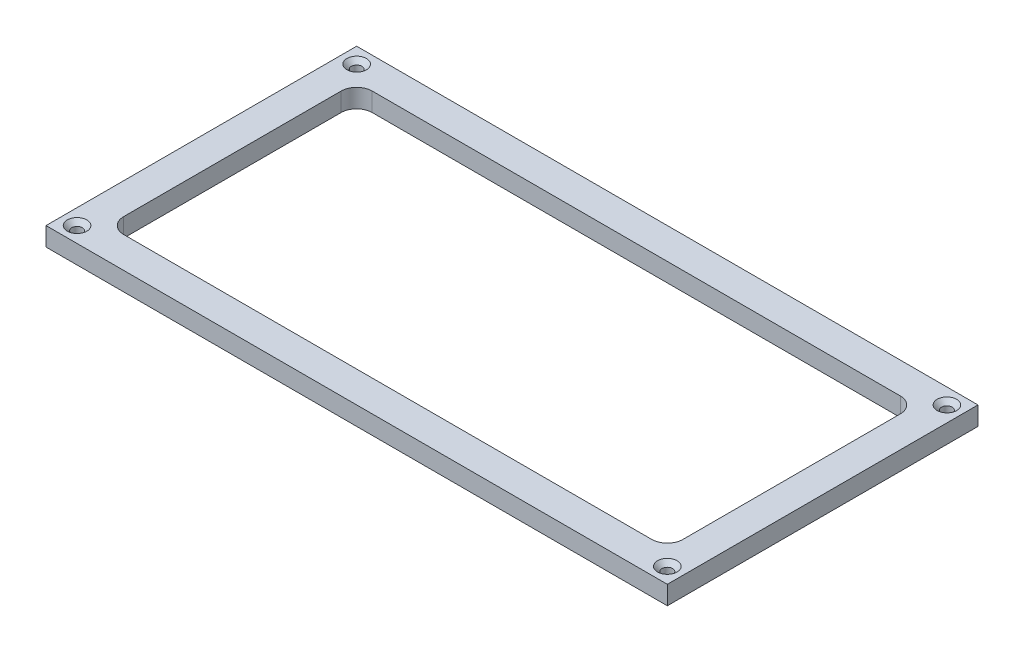
ISO-10303-21;
HEADER;
FILE_DESCRIPTION(('STEP AP214'),'2;1');
FILE_NAME('part.step','',(''),(''),'','','');
FILE_SCHEMA(('AUTOMOTIVE_DESIGN { 1 0 10303 214 1 1 1 1 }'));
ENDSEC;
DATA;
#1=APPLICATION_CONTEXT('core data for automotive mechanical design processes');
#2=APPLICATION_PROTOCOL_DEFINITION('international standard','automotive_design',2000,#1);
#3=PRODUCT_CONTEXT('',#1,'mechanical');
#4=PRODUCT('Part','Part','',(#3));
#5=PRODUCT_RELATED_PRODUCT_CATEGORY('part','',(#4));
#6=PRODUCT_DEFINITION_FORMATION('','',#4);
#7=PRODUCT_DEFINITION_CONTEXT('part definition',#1,'design');
#8=PRODUCT_DEFINITION('design','',#6,#7);
#9=PRODUCT_DEFINITION_SHAPE('','',#8);
#10=(LENGTH_UNIT() NAMED_UNIT(*) SI_UNIT(.MILLI.,.METRE.));
#11=(NAMED_UNIT(*) PLANE_ANGLE_UNIT() SI_UNIT($,.RADIAN.));
#12=(NAMED_UNIT(*) SI_UNIT($,.STERADIAN.) SOLID_ANGLE_UNIT());
#13=UNCERTAINTY_MEASURE_WITH_UNIT(LENGTH_MEASURE(1.E-05),#10,'distance_accuracy_value','');
#14=(GEOMETRIC_REPRESENTATION_CONTEXT(3) GLOBAL_UNCERTAINTY_ASSIGNED_CONTEXT((#13)) GLOBAL_UNIT_ASSIGNED_CONTEXT((#10,
#11,#12)) REPRESENTATION_CONTEXT('',''));
#15=CARTESIAN_POINT('',(0.,0.,0.));
#16=DIRECTION('',(0.,0.,1.));
#17=DIRECTION('',(1.,0.,0.));
#18=AXIS2_PLACEMENT_3D('',#15,#16,#17);
#19=CARTESIAN_POINT('',(0.,6.,0.));
#20=DIRECTION('',(0.,-1.,0.));
#21=DIRECTION('',(0.,0.,-1.));
#22=AXIS2_PLACEMENT_3D('',#19,#20,#21);
#23=PLANE('',#22);
#24=CARTESIAN_POINT('',(5.,6.,-95.));
#25=DIRECTION('',(0.,1.,0.));
#26=DIRECTION('',(0.,0.,1.));
#27=AXIS2_PLACEMENT_3D('',#24,#25,#26);
#28=CIRCLE('',#27,3.15);
#29=CARTESIAN_POINT('',(5.,6.,-91.85));
#30=VERTEX_POINT('',#29);
#31=EDGE_CURVE('E308',#30,#30,#28,.T.);
#32=ORIENTED_EDGE('',*,*,#31,.F.);
#33=EDGE_LOOP('',(#32));
#34=FACE_BOUND('',#33,.T.);
#35=CARTESIAN_POINT('',(195.,6.,-95.));
#36=DIRECTION('',(0.,1.,0.));
#37=DIRECTION('',(0.,0.,1.));
#38=AXIS2_PLACEMENT_3D('',#35,#36,#37);
#39=CIRCLE('',#38,3.14999999999999);
#40=CARTESIAN_POINT('',(195.,6.,-91.85));
#41=VERTEX_POINT('',#40);
#42=EDGE_CURVE('E301',#41,#41,#39,.T.);
#43=ORIENTED_EDGE('',*,*,#42,.F.);
#44=EDGE_LOOP('',(#43));
#45=FACE_BOUND('',#44,.T.);
#46=CARTESIAN_POINT('',(195.,6.,-5.));
#47=DIRECTION('',(0.,1.,0.));
#48=DIRECTION('',(0.,0.,1.));
#49=AXIS2_PLACEMENT_3D('',#46,#47,#48);
#50=CIRCLE('',#49,3.14999999999999);
#51=CARTESIAN_POINT('',(195.,6.,-1.85000000000001));
#52=VERTEX_POINT('',#51);
#53=EDGE_CURVE('E294',#52,#52,#50,.T.);
#54=ORIENTED_EDGE('',*,*,#53,.F.);
#55=EDGE_LOOP('',(#54));
#56=FACE_BOUND('',#55,.T.);
#57=DIRECTION('',(0.,0.,1.));
#58=VECTOR('',#57,1.);
#59=CARTESIAN_POINT('',(0.,6.,0.));
#60=LINE('',#59,#58);
#61=CARTESIAN_POINT('',(0.,6.,-100.));
#62=VERTEX_POINT('',#61);
#63=CARTESIAN_POINT('',(0.,6.,0.));
#64=VERTEX_POINT('',#63);
#65=EDGE_CURVE('E134',#62,#64,#60,.T.);
#66=ORIENTED_EDGE('',*,*,#65,.T.);
#67=DIRECTION('',(1.,0.,0.));
#68=VECTOR('',#67,1.);
#69=CARTESIAN_POINT('',(0.,6.,0.));
#70=LINE('',#69,#68);
#71=CARTESIAN_POINT('',(200.,6.,0.));
#72=VERTEX_POINT('',#71);
#73=EDGE_CURVE('E123',#64,#72,#70,.T.);
#74=ORIENTED_EDGE('',*,*,#73,.T.);
#75=DIRECTION('',(0.,0.,-1.));
#76=VECTOR('',#75,1.);
#77=CARTESIAN_POINT('',(200.,6.,0.));
#78=LINE('',#77,#76);
#79=CARTESIAN_POINT('',(200.,6.,-100.));
#80=VERTEX_POINT('',#79);
#81=EDGE_CURVE('E133',#72,#80,#78,.T.);
#82=ORIENTED_EDGE('',*,*,#81,.T.);
#83=DIRECTION('',(-1.,0.,0.));
#84=VECTOR('',#83,1.);
#85=CARTESIAN_POINT('',(0.,6.,-100.));
#86=LINE('',#85,#84);
#87=EDGE_CURVE('E139',#80,#62,#86,.T.);
#88=ORIENTED_EDGE('',*,*,#87,.T.);
#89=EDGE_LOOP('',(#66,#74,#82,#88));
#90=FACE_BOUND('',#89,.T.);
#91=DIRECTION('',(1.,0.,0.));
#92=VECTOR('',#91,1.);
#93=CARTESIAN_POINT('',(10.,6.,-10.));
#94=LINE('',#93,#92);
#95=CARTESIAN_POINT('',(15.,6.,-10.));
#96=VERTEX_POINT('',#95);
#97=CARTESIAN_POINT('',(185.,6.,-10.));
#98=VERTEX_POINT('',#97);
#99=EDGE_CURVE('E218',#96,#98,#94,.T.);
#100=ORIENTED_EDGE('',*,*,#99,.F.);
#101=CARTESIAN_POINT('',(15.,6.,-15.));
#102=DIRECTION('',(0.,-1.,0.));
#103=DIRECTION('',(0.,0.,-1.));
#104=AXIS2_PLACEMENT_3D('',#101,#102,#103);
#105=CIRCLE('',#104,5.);
#106=CARTESIAN_POINT('',(10.,6.,-15.));
#107=VERTEX_POINT('',#106);
#108=EDGE_CURVE('E172',#96,#107,#105,.T.);
#109=ORIENTED_EDGE('',*,*,#108,.T.);
#110=DIRECTION('',(0.,0.,1.));
#111=VECTOR('',#110,1.);
#112=CARTESIAN_POINT('',(10.,6.,-90.));
#113=LINE('',#112,#111);
#114=CARTESIAN_POINT('',(10.,6.,-85.));
#115=VERTEX_POINT('',#114);
#116=EDGE_CURVE('E188',#115,#107,#113,.T.);
#117=ORIENTED_EDGE('',*,*,#116,.F.);
#118=CARTESIAN_POINT('',(15.,6.,-85.));
#119=DIRECTION('',(0.,-1.,0.));
#120=DIRECTION('',(0.,0.,-1.));
#121=AXIS2_PLACEMENT_3D('',#118,#119,#120);
#122=CIRCLE('',#121,5.);
#123=CARTESIAN_POINT('',(15.,6.,-90.));
#124=VERTEX_POINT('',#123);
#125=EDGE_CURVE('E41',#115,#124,#122,.T.);
#126=ORIENTED_EDGE('',*,*,#125,.T.);
#127=DIRECTION('',(-1.,0.,0.));
#128=VECTOR('',#127,1.);
#129=CARTESIAN_POINT('',(10.,6.,-90.));
#130=LINE('',#129,#128);
#131=CARTESIAN_POINT('',(185.,6.,-90.));
#132=VERTEX_POINT('',#131);
#133=EDGE_CURVE('E186',#132,#124,#130,.T.);
#134=ORIENTED_EDGE('',*,*,#133,.F.);
#135=CARTESIAN_POINT('',(185.,6.,-85.));
#136=DIRECTION('',(0.,-1.,0.));
#137=DIRECTION('',(0.,0.,-1.));
#138=AXIS2_PLACEMENT_3D('',#135,#136,#137);
#139=CIRCLE('',#138,5.);
#140=CARTESIAN_POINT('',(190.,6.,-85.));
#141=VERTEX_POINT('',#140);
#142=EDGE_CURVE('E180',#132,#141,#139,.T.);
#143=ORIENTED_EDGE('',*,*,#142,.T.);
#144=DIRECTION('',(0.,0.,-1.));
#145=VECTOR('',#144,1.);
#146=CARTESIAN_POINT('',(190.,6.,-90.));
#147=LINE('',#146,#145);
#148=CARTESIAN_POINT('',(190.,6.,-15.));
#149=VERTEX_POINT('',#148);
#150=EDGE_CURVE('E194',#149,#141,#147,.T.);
#151=ORIENTED_EDGE('',*,*,#150,.F.);
#152=CARTESIAN_POINT('',(185.,6.,-15.));
#153=DIRECTION('',(0.,-1.,0.));
#154=DIRECTION('',(0.,0.,-1.));
#155=AXIS2_PLACEMENT_3D('',#152,#153,#154);
#156=CIRCLE('',#155,5.);
#157=EDGE_CURVE('E176',#149,#98,#156,.T.);
#158=ORIENTED_EDGE('',*,*,#157,.T.);
#159=EDGE_LOOP('',(#100,#109,#117,#126,#134,#143,#151,#158));
#160=FACE_BOUND('',#159,.T.);
#161=CARTESIAN_POINT('',(5.,6.,-5.));
#162=DIRECTION('',(0.,1.,0.));
#163=DIRECTION('',(0.,0.,1.));
#164=AXIS2_PLACEMENT_3D('',#161,#162,#163);
#165=CIRCLE('',#164,3.15);
#166=CARTESIAN_POINT('',(5.,6.,-1.85));
#167=VERTEX_POINT('',#166);
#168=EDGE_CURVE('E284',#167,#167,#165,.T.);
#169=ORIENTED_EDGE('',*,*,#168,.F.);
#170=EDGE_LOOP('',(#169));
#171=FACE_BOUND('',#170,.T.);
#172=ADVANCED_FACE('F33',(#34,#45,#56,#90,#160,#171),#23,.F.);
#173=CARTESIAN_POINT('',(0.,6.,0.));
#174=DIRECTION('',(1.,0.,0.));
#175=DIRECTION('',(0.,0.,-1.));
#176=AXIS2_PLACEMENT_3D('',#173,#174,#175);
#177=PLANE('',#176);
#178=DIRECTION('',(0.,0.,1.));
#179=VECTOR('',#178,1.);
#180=CARTESIAN_POINT('',(0.,0.,0.));
#181=LINE('',#180,#179);
#182=CARTESIAN_POINT('',(0.,0.,-100.));
#183=VERTEX_POINT('',#182);
#184=CARTESIAN_POINT('',(0.,0.,0.));
#185=VERTEX_POINT('',#184);
#186=EDGE_CURVE('E147',#183,#185,#181,.T.);
#187=ORIENTED_EDGE('',*,*,#186,.T.);
#188=DIRECTION('',(0.,-1.,0.));
#189=VECTOR('',#188,1.);
#190=CARTESIAN_POINT('',(0.,6.,0.));
#191=LINE('',#190,#189);
#192=EDGE_CURVE('E127',#64,#185,#191,.T.);
#193=ORIENTED_EDGE('',*,*,#192,.F.);
#194=ORIENTED_EDGE('',*,*,#65,.F.);
#195=DIRECTION('',(0.,-1.,0.));
#196=VECTOR('',#195,1.);
#197=CARTESIAN_POINT('',(0.,6.,-100.));
#198=LINE('',#197,#196);
#199=EDGE_CURVE('E225',#62,#183,#198,.T.);
#200=ORIENTED_EDGE('',*,*,#199,.T.);
#201=EDGE_LOOP('',(#187,#193,#194,#200));
#202=FACE_BOUND('',#201,.T.);
#203=ADVANCED_FACE('F145',(#202),#177,.F.);
#204=CARTESIAN_POINT('',(0.,6.,0.));
#205=DIRECTION('',(0.,0.,-1.));
#206=DIRECTION('',(-1.,0.,0.));
#207=AXIS2_PLACEMENT_3D('',#204,#205,#206);
#208=PLANE('',#207);
#209=DIRECTION('',(1.,0.,0.));
#210=VECTOR('',#209,1.);
#211=CARTESIAN_POINT('',(0.,0.,0.));
#212=LINE('',#211,#210);
#213=CARTESIAN_POINT('',(200.,0.,0.));
#214=VERTEX_POINT('',#213);
#215=EDGE_CURVE('E227',#185,#214,#212,.T.);
#216=ORIENTED_EDGE('',*,*,#215,.T.);
#217=DIRECTION('',(0.,-1.,0.));
#218=VECTOR('',#217,1.);
#219=CARTESIAN_POINT('',(200.,6.,0.));
#220=LINE('',#219,#218);
#221=EDGE_CURVE('E130',#72,#214,#220,.T.);
#222=ORIENTED_EDGE('',*,*,#221,.F.);
#223=ORIENTED_EDGE('',*,*,#73,.F.);
#224=ORIENTED_EDGE('',*,*,#192,.T.);
#225=EDGE_LOOP('',(#216,#222,#223,#224));
#226=FACE_BOUND('',#225,.T.);
#227=ADVANCED_FACE('F125',(#226),#208,.F.);
#228=CARTESIAN_POINT('',(200.,6.,0.));
#229=DIRECTION('',(-1.,0.,0.));
#230=DIRECTION('',(0.,0.,1.));
#231=AXIS2_PLACEMENT_3D('',#228,#229,#230);
#232=PLANE('',#231);
#233=DIRECTION('',(0.,0.,-1.));
#234=VECTOR('',#233,1.);
#235=CARTESIAN_POINT('',(200.,0.,0.));
#236=LINE('',#235,#234);
#237=CARTESIAN_POINT('',(200.,0.,-100.));
#238=VERTEX_POINT('',#237);
#239=EDGE_CURVE('E229',#214,#238,#236,.T.);
#240=ORIENTED_EDGE('',*,*,#239,.T.);
#241=DIRECTION('',(0.,-1.,0.));
#242=VECTOR('',#241,1.);
#243=CARTESIAN_POINT('',(200.,6.,-100.));
#244=LINE('',#243,#242);
#245=EDGE_CURVE('E152',#80,#238,#244,.T.);
#246=ORIENTED_EDGE('',*,*,#245,.F.);
#247=ORIENTED_EDGE('',*,*,#81,.F.);
#248=ORIENTED_EDGE('',*,*,#221,.T.);
#249=EDGE_LOOP('',(#240,#246,#247,#248));
#250=FACE_BOUND('',#249,.T.);
#251=ADVANCED_FACE('F239',(#250),#232,.F.);
#252=CARTESIAN_POINT('',(0.,6.,-100.));
#253=DIRECTION('',(0.,0.,1.));
#254=DIRECTION('',(1.,0.,0.));
#255=AXIS2_PLACEMENT_3D('',#252,#253,#254);
#256=PLANE('',#255);
#257=DIRECTION('',(-1.,0.,0.));
#258=VECTOR('',#257,1.);
#259=CARTESIAN_POINT('',(0.,0.,-100.));
#260=LINE('',#259,#258);
#261=EDGE_CURVE('E143',#238,#183,#260,.T.);
#262=ORIENTED_EDGE('',*,*,#261,.T.);
#263=ORIENTED_EDGE('',*,*,#199,.F.);
#264=ORIENTED_EDGE('',*,*,#87,.F.);
#265=ORIENTED_EDGE('',*,*,#245,.T.);
#266=EDGE_LOOP('',(#262,#263,#264,#265));
#267=FACE_BOUND('',#266,.T.);
#268=ADVANCED_FACE('F236',(#267),#256,.F.);
#269=CARTESIAN_POINT('',(0.,0.,0.));
#270=DIRECTION('',(0.,-1.,0.));
#271=DIRECTION('',(0.,0.,-1.));
#272=AXIS2_PLACEMENT_3D('',#269,#270,#271);
#273=PLANE('',#272);
#274=CARTESIAN_POINT('',(5.,0.,-95.));
#275=DIRECTION('',(0.,1.,0.));
#276=DIRECTION('',(0.,0.,1.));
#277=AXIS2_PLACEMENT_3D('',#274,#275,#276);
#278=CIRCLE('',#277,1.7);
#279=CARTESIAN_POINT('',(5.,0.,-93.3));
#280=VERTEX_POINT('',#279);
#281=EDGE_CURVE('E270',#280,#280,#278,.T.);
#282=ORIENTED_EDGE('',*,*,#281,.T.);
#283=EDGE_LOOP('',(#282));
#284=FACE_BOUND('',#283,.T.);
#285=CARTESIAN_POINT('',(195.,0.,-95.));
#286=DIRECTION('',(0.,1.,0.));
#287=DIRECTION('',(0.,0.,1.));
#288=AXIS2_PLACEMENT_3D('',#285,#286,#287);
#289=CIRCLE('',#288,1.70000000000001);
#290=CARTESIAN_POINT('',(195.,0.,-93.3));
#291=VERTEX_POINT('',#290);
#292=EDGE_CURVE('E274',#291,#291,#289,.T.);
#293=ORIENTED_EDGE('',*,*,#292,.T.);
#294=EDGE_LOOP('',(#293));
#295=FACE_BOUND('',#294,.T.);
#296=CARTESIAN_POINT('',(195.,0.,-5.));
#297=DIRECTION('',(0.,1.,0.));
#298=DIRECTION('',(0.,0.,1.));
#299=AXIS2_PLACEMENT_3D('',#296,#297,#298);
#300=CIRCLE('',#299,1.70000000000001);
#301=CARTESIAN_POINT('',(195.,0.,-3.29999999999999));
#302=VERTEX_POINT('',#301);
#303=EDGE_CURVE('E278',#302,#302,#300,.T.);
#304=ORIENTED_EDGE('',*,*,#303,.T.);
#305=EDGE_LOOP('',(#304));
#306=FACE_BOUND('',#305,.T.);
#307=CARTESIAN_POINT('',(5.,0.,-5.));
#308=DIRECTION('',(0.,1.,0.));
#309=DIRECTION('',(0.,0.,1.));
#310=AXIS2_PLACEMENT_3D('',#307,#308,#309);
#311=CIRCLE('',#310,1.7);
#312=CARTESIAN_POINT('',(5.,0.,-3.30000000000001));
#313=VERTEX_POINT('',#312);
#314=EDGE_CURVE('E212',#313,#313,#311,.T.);
#315=ORIENTED_EDGE('',*,*,#314,.T.);
#316=EDGE_LOOP('',(#315));
#317=FACE_BOUND('',#316,.T.);
#318=DIRECTION('',(-1.,0.,0.));
#319=VECTOR('',#318,1.);
#320=CARTESIAN_POINT('',(10.,0.,-90.));
#321=LINE('',#320,#319);
#322=CARTESIAN_POINT('',(185.,0.,-90.));
#323=VERTEX_POINT('',#322);
#324=CARTESIAN_POINT('',(15.,0.,-90.));
#325=VERTEX_POINT('',#324);
#326=EDGE_CURVE('E202',#323,#325,#321,.T.);
#327=ORIENTED_EDGE('',*,*,#326,.T.);
#328=CARTESIAN_POINT('',(15.,0.,-85.));
#329=DIRECTION('',(0.,-1.,0.));
#330=DIRECTION('',(0.,0.,-1.));
#331=AXIS2_PLACEMENT_3D('',#328,#329,#330);
#332=CIRCLE('',#331,5.);
#333=CARTESIAN_POINT('',(10.,0.,-85.));
#334=VERTEX_POINT('',#333);
#335=EDGE_CURVE('E11',#325,#334,#332,.F.);
#336=ORIENTED_EDGE('',*,*,#335,.T.);
#337=DIRECTION('',(0.,0.,1.));
#338=VECTOR('',#337,1.);
#339=CARTESIAN_POINT('',(10.,0.,-90.));
#340=LINE('',#339,#338);
#341=CARTESIAN_POINT('',(10.,0.,-15.));
#342=VERTEX_POINT('',#341);
#343=EDGE_CURVE('E193',#334,#342,#340,.T.);
#344=ORIENTED_EDGE('',*,*,#343,.T.);
#345=CARTESIAN_POINT('',(15.,0.,-15.));
#346=DIRECTION('',(0.,-1.,0.));
#347=DIRECTION('',(0.,0.,-1.));
#348=AXIS2_PLACEMENT_3D('',#345,#346,#347);
#349=CIRCLE('',#348,5.);
#350=CARTESIAN_POINT('',(15.,0.,-10.));
#351=VERTEX_POINT('',#350);
#352=EDGE_CURVE('E174',#342,#351,#349,.F.);
#353=ORIENTED_EDGE('',*,*,#352,.T.);
#354=DIRECTION('',(1.,0.,0.));
#355=VECTOR('',#354,1.);
#356=CARTESIAN_POINT('',(10.,0.,-10.));
#357=LINE('',#356,#355);
#358=CARTESIAN_POINT('',(185.,0.,-10.));
#359=VERTEX_POINT('',#358);
#360=EDGE_CURVE('E206',#351,#359,#357,.T.);
#361=ORIENTED_EDGE('',*,*,#360,.T.);
#362=CARTESIAN_POINT('',(185.,0.,-15.));
#363=DIRECTION('',(0.,-1.,0.));
#364=DIRECTION('',(0.,0.,-1.));
#365=AXIS2_PLACEMENT_3D('',#362,#363,#364);
#366=CIRCLE('',#365,5.);
#367=CARTESIAN_POINT('',(190.,0.,-15.));
#368=VERTEX_POINT('',#367);
#369=EDGE_CURVE('E178',#359,#368,#366,.F.);
#370=ORIENTED_EDGE('',*,*,#369,.T.);
#371=DIRECTION('',(0.,0.,-1.));
#372=VECTOR('',#371,1.);
#373=CARTESIAN_POINT('',(190.,0.,-90.));
#374=LINE('',#373,#372);
#375=CARTESIAN_POINT('',(190.,0.,-85.));
#376=VERTEX_POINT('',#375);
#377=EDGE_CURVE('E209',#368,#376,#374,.T.);
#378=ORIENTED_EDGE('',*,*,#377,.T.);
#379=CARTESIAN_POINT('',(185.,0.,-85.));
#380=DIRECTION('',(0.,-1.,0.));
#381=DIRECTION('',(0.,0.,-1.));
#382=AXIS2_PLACEMENT_3D('',#379,#380,#381);
#383=CIRCLE('',#382,5.);
#384=EDGE_CURVE('E55',#376,#323,#383,.F.);
#385=ORIENTED_EDGE('',*,*,#384,.T.);
#386=EDGE_LOOP('',(#327,#336,#344,#353,#361,#370,#378,#385));
#387=FACE_BOUND('',#386,.T.);
#388=ORIENTED_EDGE('',*,*,#186,.F.);
#389=ORIENTED_EDGE('',*,*,#261,.F.);
#390=ORIENTED_EDGE('',*,*,#239,.F.);
#391=ORIENTED_EDGE('',*,*,#215,.F.);
#392=EDGE_LOOP('',(#388,#389,#390,#391));
#393=FACE_BOUND('',#392,.T.);
#394=ADVANCED_FACE('F199',(#284,#295,#306,#317,#387,#393),#273,.T.);
#395=CARTESIAN_POINT('',(10.,0.,-90.));
#396=DIRECTION('',(-1.,0.,0.));
#397=DIRECTION('',(0.,0.,1.));
#398=AXIS2_PLACEMENT_3D('',#395,#396,#397);
#399=PLANE('',#398);
#400=ORIENTED_EDGE('',*,*,#116,.T.);
#401=DIRECTION('',(0.,1.,0.));
#402=VECTOR('',#401,1.);
#403=CARTESIAN_POINT('',(10.,0.,-15.));
#404=LINE('',#403,#402);
#405=EDGE_CURVE('E161',#107,#342,#404,.F.);
#406=ORIENTED_EDGE('',*,*,#405,.T.);
#407=ORIENTED_EDGE('',*,*,#343,.F.);
#408=DIRECTION('',(0.,1.,0.));
#409=VECTOR('',#408,1.);
#410=CARTESIAN_POINT('',(10.,6.,-85.));
#411=LINE('',#410,#409);
#412=EDGE_CURVE('E158',#334,#115,#411,.T.);
#413=ORIENTED_EDGE('',*,*,#412,.T.);
#414=EDGE_LOOP('',(#400,#406,#407,#413));
#415=FACE_BOUND('',#414,.T.);
#416=ADVANCED_FACE('F204',(#415),#399,.F.);
#417=CARTESIAN_POINT('',(10.,0.,-90.));
#418=DIRECTION('',(0.,0.,-1.));
#419=DIRECTION('',(-1.,0.,0.));
#420=AXIS2_PLACEMENT_3D('',#417,#418,#419);
#421=PLANE('',#420);
#422=ORIENTED_EDGE('',*,*,#326,.F.);
#423=DIRECTION('',(0.,1.,0.));
#424=VECTOR('',#423,1.);
#425=CARTESIAN_POINT('',(185.,6.,-90.));
#426=LINE('',#425,#424);
#427=EDGE_CURVE('E169',#323,#132,#426,.T.);
#428=ORIENTED_EDGE('',*,*,#427,.T.);
#429=ORIENTED_EDGE('',*,*,#133,.T.);
#430=DIRECTION('',(0.,1.,0.));
#431=VECTOR('',#430,1.);
#432=CARTESIAN_POINT('',(15.,0.,-90.));
#433=LINE('',#432,#431);
#434=EDGE_CURVE('E48',#124,#325,#433,.F.);
#435=ORIENTED_EDGE('',*,*,#434,.T.);
#436=EDGE_LOOP('',(#422,#428,#429,#435));
#437=FACE_BOUND('',#436,.T.);
#438=ADVANCED_FACE('F191',(#437),#421,.F.);
#439=CARTESIAN_POINT('',(190.,0.,-90.));
#440=DIRECTION('',(1.,0.,0.));
#441=DIRECTION('',(0.,0.,-1.));
#442=AXIS2_PLACEMENT_3D('',#439,#440,#441);
#443=PLANE('',#442);
#444=ORIENTED_EDGE('',*,*,#377,.F.);
#445=DIRECTION('',(0.,1.,0.));
#446=VECTOR('',#445,1.);
#447=CARTESIAN_POINT('',(190.,6.,-15.));
#448=LINE('',#447,#446);
#449=EDGE_CURVE('E165',#368,#149,#448,.T.);
#450=ORIENTED_EDGE('',*,*,#449,.T.);
#451=ORIENTED_EDGE('',*,*,#150,.T.);
#452=DIRECTION('',(0.,1.,0.));
#453=VECTOR('',#452,1.);
#454=CARTESIAN_POINT('',(190.,0.,-85.));
#455=LINE('',#454,#453);
#456=EDGE_CURVE('E163',#141,#376,#455,.F.);
#457=ORIENTED_EDGE('',*,*,#456,.T.);
#458=EDGE_LOOP('',(#444,#450,#451,#457));
#459=FACE_BOUND('',#458,.T.);
#460=ADVANCED_FACE('F348',(#459),#443,.F.);
#461=CARTESIAN_POINT('',(10.,0.,-10.));
#462=DIRECTION('',(0.,0.,1.));
#463=DIRECTION('',(1.,0.,0.));
#464=AXIS2_PLACEMENT_3D('',#461,#462,#463);
#465=PLANE('',#464);
#466=ORIENTED_EDGE('',*,*,#360,.F.);
#467=DIRECTION('',(0.,1.,0.));
#468=VECTOR('',#467,1.);
#469=CARTESIAN_POINT('',(15.,6.,-10.));
#470=LINE('',#469,#468);
#471=EDGE_CURVE('E150',#351,#96,#470,.T.);
#472=ORIENTED_EDGE('',*,*,#471,.T.);
#473=ORIENTED_EDGE('',*,*,#99,.T.);
#474=DIRECTION('',(0.,1.,0.));
#475=VECTOR('',#474,1.);
#476=CARTESIAN_POINT('',(185.,0.,-10.));
#477=LINE('',#476,#475);
#478=EDGE_CURVE('E148',#98,#359,#477,.F.);
#479=ORIENTED_EDGE('',*,*,#478,.T.);
#480=EDGE_LOOP('',(#466,#472,#473,#479));
#481=FACE_BOUND('',#480,.T.);
#482=ADVANCED_FACE('F350',(#481),#465,.F.);
#483=CARTESIAN_POINT('',(15.,0.,-15.));
#484=DIRECTION('',(0.,-1.,0.));
#485=DIRECTION('',(0.,0.,-1.));
#486=AXIS2_PLACEMENT_3D('',#483,#484,#485);
#487=CYLINDRICAL_SURFACE('',#486,5.);
#488=ORIENTED_EDGE('',*,*,#352,.F.);
#489=ORIENTED_EDGE('',*,*,#405,.F.);
#490=ORIENTED_EDGE('',*,*,#108,.F.);
#491=ORIENTED_EDGE('',*,*,#471,.F.);
#492=EDGE_LOOP('',(#488,#489,#490,#491));
#493=FACE_BOUND('',#492,.T.);
#494=ADVANCED_FACE('F353',(#493),#487,.F.);
#495=CARTESIAN_POINT('',(185.,0.,-15.));
#496=DIRECTION('',(0.,-1.,0.));
#497=DIRECTION('',(0.,0.,-1.));
#498=AXIS2_PLACEMENT_3D('',#495,#496,#497);
#499=CYLINDRICAL_SURFACE('',#498,5.);
#500=ORIENTED_EDGE('',*,*,#369,.F.);
#501=ORIENTED_EDGE('',*,*,#478,.F.);
#502=ORIENTED_EDGE('',*,*,#157,.F.);
#503=ORIENTED_EDGE('',*,*,#449,.F.);
#504=EDGE_LOOP('',(#500,#501,#502,#503));
#505=FACE_BOUND('',#504,.T.);
#506=ADVANCED_FACE('F358',(#505),#499,.F.);
#507=CARTESIAN_POINT('',(185.,0.,-85.));
#508=DIRECTION('',(0.,-1.,0.));
#509=DIRECTION('',(0.,0.,-1.));
#510=AXIS2_PLACEMENT_3D('',#507,#508,#509);
#511=CYLINDRICAL_SURFACE('',#510,5.);
#512=ORIENTED_EDGE('',*,*,#384,.F.);
#513=ORIENTED_EDGE('',*,*,#456,.F.);
#514=ORIENTED_EDGE('',*,*,#142,.F.);
#515=ORIENTED_EDGE('',*,*,#427,.F.);
#516=EDGE_LOOP('',(#512,#513,#514,#515));
#517=FACE_BOUND('',#516,.T.);
#518=ADVANCED_FACE('F371',(#517),#511,.F.);
#519=CARTESIAN_POINT('',(15.,0.,-85.));
#520=DIRECTION('',(0.,-1.,0.));
#521=DIRECTION('',(0.,0.,-1.));
#522=AXIS2_PLACEMENT_3D('',#519,#520,#521);
#523=CYLINDRICAL_SURFACE('',#522,5.);
#524=ORIENTED_EDGE('',*,*,#335,.F.);
#525=ORIENTED_EDGE('',*,*,#434,.F.);
#526=ORIENTED_EDGE('',*,*,#125,.F.);
#527=ORIENTED_EDGE('',*,*,#412,.F.);
#528=EDGE_LOOP('',(#524,#525,#526,#527));
#529=FACE_BOUND('',#528,.T.);
#530=ADVANCED_FACE('F35',(#529),#523,.F.);
#531=CARTESIAN_POINT('',(5.,6.,-5.));
#532=DIRECTION('',(0.,1.,0.));
#533=DIRECTION('',(0.,0.,1.));
#534=AXIS2_PLACEMENT_3D('',#531,#532,#533);
#535=CYLINDRICAL_SURFACE('',#534,1.7);
#536=ORIENTED_EDGE('',*,*,#314,.F.);
#537=EDGE_LOOP('',(#536));
#538=FACE_BOUND('',#537,.T.);
#539=CARTESIAN_POINT('',(5.,4.55,-5.));
#540=DIRECTION('',(0.,1.,0.));
#541=DIRECTION('',(0.,0.,1.));
#542=AXIS2_PLACEMENT_3D('',#539,#540,#541);
#543=CIRCLE('',#542,1.7);
#544=CARTESIAN_POINT('',(5.,4.55,-3.30000000000001));
#545=VERTEX_POINT('',#544);
#546=EDGE_CURVE('E282',#545,#545,#543,.T.);
#547=ORIENTED_EDGE('',*,*,#546,.T.);
#548=EDGE_LOOP('',(#547));
#549=FACE_BOUND('',#548,.T.);
#550=ADVANCED_FACE('F342',(#538,#549),#535,.F.);
#551=CARTESIAN_POINT('',(5.,6.,-5.));
#552=DIRECTION('',(0.,1.,0.));
#553=DIRECTION('',(0.,0.,1.));
#554=AXIS2_PLACEMENT_3D('',#551,#552,#553);
#555=CONICAL_SURFACE('',#554,3.15,0.785398163397449);
#556=ORIENTED_EDGE('',*,*,#546,.F.);
#557=EDGE_LOOP('',(#556));
#558=FACE_BOUND('',#557,.T.);
#559=ORIENTED_EDGE('',*,*,#168,.T.);
#560=EDGE_LOOP('',(#559));
#561=FACE_BOUND('',#560,.T.);
#562=ADVANCED_FACE('F338',(#558,#561),#555,.F.);
#563=CARTESIAN_POINT('',(195.,6.,-5.));
#564=DIRECTION('',(0.,1.,0.));
#565=DIRECTION('',(0.,0.,1.));
#566=AXIS2_PLACEMENT_3D('',#563,#564,#565);
#567=CYLINDRICAL_SURFACE('',#566,1.70000000000001);
#568=ORIENTED_EDGE('',*,*,#303,.F.);
#569=EDGE_LOOP('',(#568));
#570=FACE_BOUND('',#569,.T.);
#571=CARTESIAN_POINT('',(195.,4.55,-5.));
#572=DIRECTION('',(0.,1.,0.));
#573=DIRECTION('',(0.,0.,1.));
#574=AXIS2_PLACEMENT_3D('',#571,#572,#573);
#575=CIRCLE('',#574,1.70000000000001);
#576=CARTESIAN_POINT('',(195.,4.55,-3.29999999999999));
#577=VERTEX_POINT('',#576);
#578=EDGE_CURVE('E291',#577,#577,#575,.T.);
#579=ORIENTED_EDGE('',*,*,#578,.T.);
#580=EDGE_LOOP('',(#579));
#581=FACE_BOUND('',#580,.T.);
#582=ADVANCED_FACE('F334',(#570,#581),#567,.F.);
#583=CARTESIAN_POINT('',(195.,6.,-5.));
#584=DIRECTION('',(0.,1.,0.));
#585=DIRECTION('',(0.,0.,1.));
#586=AXIS2_PLACEMENT_3D('',#583,#584,#585);
#587=CONICAL_SURFACE('',#586,3.14999999999999,0.785398163397441);
#588=ORIENTED_EDGE('',*,*,#578,.F.);
#589=EDGE_LOOP('',(#588));
#590=FACE_BOUND('',#589,.T.);
#591=ORIENTED_EDGE('',*,*,#53,.T.);
#592=EDGE_LOOP('',(#591));
#593=FACE_BOUND('',#592,.T.);
#594=ADVANCED_FACE('F330',(#590,#593),#587,.F.);
#595=CARTESIAN_POINT('',(195.,6.,-95.));
#596=DIRECTION('',(0.,1.,0.));
#597=DIRECTION('',(0.,0.,1.));
#598=AXIS2_PLACEMENT_3D('',#595,#596,#597);
#599=CYLINDRICAL_SURFACE('',#598,1.70000000000001);
#600=ORIENTED_EDGE('',*,*,#292,.F.);
#601=EDGE_LOOP('',(#600));
#602=FACE_BOUND('',#601,.T.);
#603=CARTESIAN_POINT('',(195.,4.55,-95.));
#604=DIRECTION('',(0.,1.,0.));
#605=DIRECTION('',(0.,0.,1.));
#606=AXIS2_PLACEMENT_3D('',#603,#604,#605);
#607=CIRCLE('',#606,1.70000000000001);
#608=CARTESIAN_POINT('',(195.,4.55,-93.3));
#609=VERTEX_POINT('',#608);
#610=EDGE_CURVE('E298',#609,#609,#607,.T.);
#611=ORIENTED_EDGE('',*,*,#610,.T.);
#612=EDGE_LOOP('',(#611));
#613=FACE_BOUND('',#612,.T.);
#614=ADVANCED_FACE('F326',(#602,#613),#599,.F.);
#615=CARTESIAN_POINT('',(195.,6.,-95.));
#616=DIRECTION('',(0.,1.,0.));
#617=DIRECTION('',(0.,0.,1.));
#618=AXIS2_PLACEMENT_3D('',#615,#616,#617);
#619=CONICAL_SURFACE('',#618,3.14999999999999,0.785398163397441);
#620=ORIENTED_EDGE('',*,*,#610,.F.);
#621=EDGE_LOOP('',(#620));
#622=FACE_BOUND('',#621,.T.);
#623=ORIENTED_EDGE('',*,*,#42,.T.);
#624=EDGE_LOOP('',(#623));
#625=FACE_BOUND('',#624,.T.);
#626=ADVANCED_FACE('F319',(#622,#625),#619,.F.);
#627=CARTESIAN_POINT('',(5.,6.,-95.));
#628=DIRECTION('',(0.,1.,0.));
#629=DIRECTION('',(0.,0.,1.));
#630=AXIS2_PLACEMENT_3D('',#627,#628,#629);
#631=CYLINDRICAL_SURFACE('',#630,1.7);
#632=ORIENTED_EDGE('',*,*,#281,.F.);
#633=EDGE_LOOP('',(#632));
#634=FACE_BOUND('',#633,.T.);
#635=CARTESIAN_POINT('',(5.,4.55,-95.));
#636=DIRECTION('',(0.,1.,0.));
#637=DIRECTION('',(0.,0.,1.));
#638=AXIS2_PLACEMENT_3D('',#635,#636,#637);
#639=CIRCLE('',#638,1.7);
#640=CARTESIAN_POINT('',(5.,4.55,-93.3));
#641=VERTEX_POINT('',#640);
#642=EDGE_CURVE('E305',#641,#641,#639,.T.);
#643=ORIENTED_EDGE('',*,*,#642,.T.);
#644=EDGE_LOOP('',(#643));
#645=FACE_BOUND('',#644,.T.);
#646=ADVANCED_FACE('F313',(#634,#645),#631,.F.);
#647=CARTESIAN_POINT('',(5.,6.,-95.));
#648=DIRECTION('',(0.,1.,0.));
#649=DIRECTION('',(0.,0.,1.));
#650=AXIS2_PLACEMENT_3D('',#647,#648,#649);
#651=CONICAL_SURFACE('',#650,3.15,0.785398163397448);
#652=ORIENTED_EDGE('',*,*,#642,.F.);
#653=EDGE_LOOP('',(#652));
#654=FACE_BOUND('',#653,.T.);
#655=ORIENTED_EDGE('',*,*,#31,.T.);
#656=EDGE_LOOP('',(#655));
#657=FACE_BOUND('',#656,.T.);
#658=ADVANCED_FACE('F311',(#654,#657),#651,.F.);
#659=CLOSED_SHELL('',(#172,#203,#227,#251,#268,#394,#416,#438,#460,#482,#494,#506,#518,#530,
#550,#562,#582,#594,#614,#626,#646,#658));
#660=MANIFOLD_SOLID_BREP('B2',#659);
#661=ADVANCED_BREP_SHAPE_REPRESENTATION('',(#18,#660),#14);
#662=SHAPE_DEFINITION_REPRESENTATION(#9,#661);
ENDSEC;
END-ISO-10303-21;
